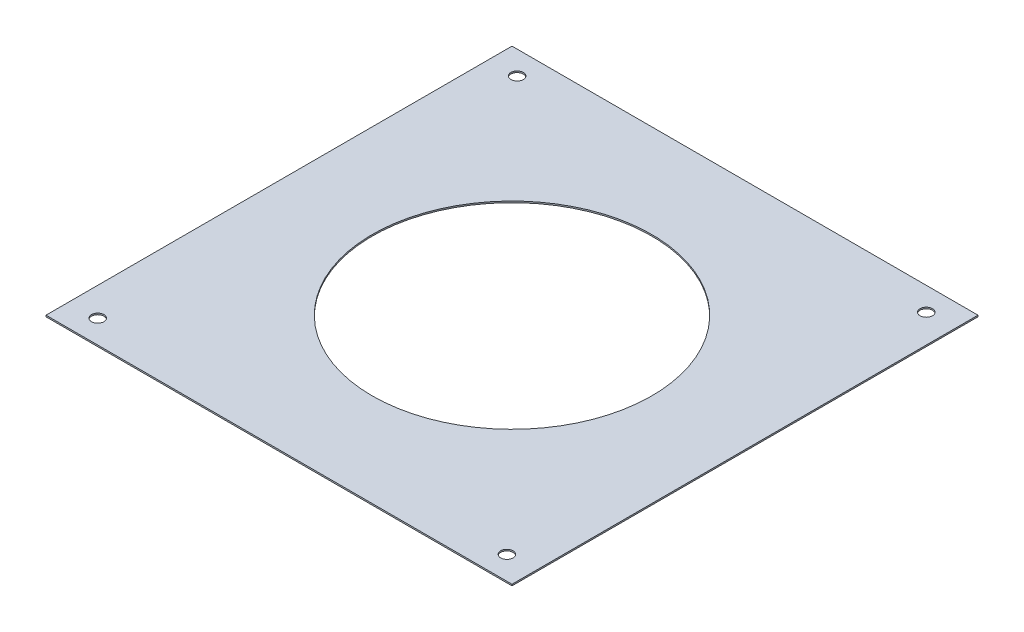
ISO-10303-21;
HEADER;
FILE_DESCRIPTION(('STEP AP214'),'2;1');
FILE_NAME('part.step','',(''),(''),'','','');
FILE_SCHEMA(('AUTOMOTIVE_DESIGN { 1 0 10303 214 1 1 1 1 }'));
ENDSEC;
DATA;
#1=APPLICATION_CONTEXT('core data for automotive mechanical design processes');
#2=APPLICATION_PROTOCOL_DEFINITION('international standard','automotive_design',2000,#1);
#3=PRODUCT_CONTEXT('',#1,'mechanical');
#4=PRODUCT('Part','Part','',(#3));
#5=PRODUCT_RELATED_PRODUCT_CATEGORY('part','',(#4));
#6=PRODUCT_DEFINITION_FORMATION('','',#4);
#7=PRODUCT_DEFINITION_CONTEXT('part definition',#1,'design');
#8=PRODUCT_DEFINITION('design','',#6,#7);
#9=PRODUCT_DEFINITION_SHAPE('','',#8);
#10=(LENGTH_UNIT() NAMED_UNIT(*) SI_UNIT(.MILLI.,.METRE.));
#11=(NAMED_UNIT(*) PLANE_ANGLE_UNIT() SI_UNIT($,.RADIAN.));
#12=(NAMED_UNIT(*) SI_UNIT($,.STERADIAN.) SOLID_ANGLE_UNIT());
#13=UNCERTAINTY_MEASURE_WITH_UNIT(LENGTH_MEASURE(1.E-05),#10,'distance_accuracy_value','');
#14=(GEOMETRIC_REPRESENTATION_CONTEXT(3) GLOBAL_UNCERTAINTY_ASSIGNED_CONTEXT((#13)) GLOBAL_UNIT_ASSIGNED_CONTEXT((#10,
#11,#12)) REPRESENTATION_CONTEXT('',''));
#15=CARTESIAN_POINT('',(0.,0.,0.));
#16=DIRECTION('',(0.,0.,1.));
#17=DIRECTION('',(1.,0.,0.));
#18=AXIS2_PLACEMENT_3D('',#15,#16,#17);
#19=CARTESIAN_POINT('',(0.,0.79375,0.));
#20=DIRECTION('',(0.,-1.,0.));
#21=DIRECTION('',(0.,0.,-1.));
#22=AXIS2_PLACEMENT_3D('',#19,#20,#21);
#23=PLANE('',#22);
#24=CARTESIAN_POINT('',(0.,0.79375,0.));
#25=DIRECTION('',(0.,1.,0.));
#26=DIRECTION('',(0.,0.,1.));
#27=AXIS2_PLACEMENT_3D('',#24,#25,#26);
#28=CIRCLE('',#27,76.2);
#29=CARTESIAN_POINT('',(0.,0.79375,76.2));
#30=VERTEX_POINT('',#29);
#31=EDGE_CURVE('E138',#30,#30,#28,.T.);
#32=ORIENTED_EDGE('',*,*,#31,.F.);
#33=EDGE_LOOP('',(#32));
#34=FACE_BOUND('',#33,.T.);
#35=CARTESIAN_POINT('',(111.506,0.79375,114.3));
#36=DIRECTION('',(0.,1.,0.));
#37=DIRECTION('',(0.,0.,1.));
#38=AXIS2_PLACEMENT_3D('',#35,#36,#37);
#39=CIRCLE('',#38,3.37819999999999);
#40=CARTESIAN_POINT('',(111.506,0.79375,117.6782));
#41=VERTEX_POINT('',#40);
#42=EDGE_CURVE('E123',#41,#41,#39,.T.);
#43=ORIENTED_EDGE('',*,*,#42,.F.);
#44=EDGE_LOOP('',(#43));
#45=FACE_BOUND('',#44,.T.);
#46=CARTESIAN_POINT('',(-111.506,0.79375,-114.3));
#47=DIRECTION('',(0.,1.,0.));
#48=DIRECTION('',(0.,0.,1.));
#49=AXIS2_PLACEMENT_3D('',#46,#47,#48);
#50=CIRCLE('',#49,3.37819999999999);
#51=CARTESIAN_POINT('',(-111.506,0.79375,-110.9218));
#52=VERTEX_POINT('',#51);
#53=EDGE_CURVE('E102',#52,#52,#50,.T.);
#54=ORIENTED_EDGE('',*,*,#53,.F.);
#55=EDGE_LOOP('',(#54));
#56=FACE_BOUND('',#55,.T.);
#57=DIRECTION('',(0.,0.,-1.));
#58=VECTOR('',#57,1.);
#59=CARTESIAN_POINT('',(127.,0.79375,127.));
#60=LINE('',#59,#58);
#61=CARTESIAN_POINT('',(127.,0.79375,127.));
#62=VERTEX_POINT('',#61);
#63=CARTESIAN_POINT('',(127.,0.79375,-127.));
#64=VERTEX_POINT('',#63);
#65=EDGE_CURVE('E87',#62,#64,#60,.T.);
#66=ORIENTED_EDGE('',*,*,#65,.T.);
#67=DIRECTION('',(-1.,0.,0.));
#68=VECTOR('',#67,1.);
#69=CARTESIAN_POINT('',(-127.,0.79375,-127.));
#70=LINE('',#69,#68);
#71=CARTESIAN_POINT('',(-127.,0.79375,-127.));
#72=VERTEX_POINT('',#71);
#73=EDGE_CURVE('E82',#64,#72,#70,.T.);
#74=ORIENTED_EDGE('',*,*,#73,.T.);
#75=DIRECTION('',(0.,0.,1.));
#76=VECTOR('',#75,1.);
#77=CARTESIAN_POINT('',(-127.,0.79375,127.));
#78=LINE('',#77,#76);
#79=CARTESIAN_POINT('',(-127.,0.79375,127.));
#80=VERTEX_POINT('',#79);
#81=EDGE_CURVE('E85',#72,#80,#78,.T.);
#82=ORIENTED_EDGE('',*,*,#81,.T.);
#83=DIRECTION('',(1.,0.,0.));
#84=VECTOR('',#83,1.);
#85=CARTESIAN_POINT('',(-127.,0.79375,127.));
#86=LINE('',#85,#84);
#87=EDGE_CURVE('E52',#80,#62,#86,.T.);
#88=ORIENTED_EDGE('',*,*,#87,.T.);
#89=EDGE_LOOP('',(#66,#74,#82,#88));
#90=FACE_BOUND('',#89,.T.);
#91=CARTESIAN_POINT('',(111.506,0.79375,-114.3));
#92=DIRECTION('',(0.,1.,0.));
#93=DIRECTION('',(0.,0.,1.));
#94=AXIS2_PLACEMENT_3D('',#91,#92,#93);
#95=CIRCLE('',#94,3.37819999999999);
#96=CARTESIAN_POINT('',(111.506,0.79375,-110.9218));
#97=VERTEX_POINT('',#96);
#98=EDGE_CURVE('E117',#97,#97,#95,.T.);
#99=ORIENTED_EDGE('',*,*,#98,.F.);
#100=EDGE_LOOP('',(#99));
#101=FACE_BOUND('',#100,.T.);
#102=CARTESIAN_POINT('',(-111.506,0.79375,114.3));
#103=DIRECTION('',(0.,1.,0.));
#104=DIRECTION('',(0.,0.,1.));
#105=AXIS2_PLACEMENT_3D('',#102,#103,#104);
#106=CIRCLE('',#105,3.37819999999999);
#107=CARTESIAN_POINT('',(-111.506,0.79375,117.6782));
#108=VERTEX_POINT('',#107);
#109=EDGE_CURVE('E129',#108,#108,#106,.T.);
#110=ORIENTED_EDGE('',*,*,#109,.F.);
#111=EDGE_LOOP('',(#110));
#112=FACE_BOUND('',#111,.T.);
#113=ADVANCED_FACE('F35',(#34,#45,#56,#90,#101,#112),#23,.F.);
#114=CARTESIAN_POINT('',(0.,0.,0.));
#115=DIRECTION('',(0.,-1.,0.));
#116=DIRECTION('',(0.,0.,-1.));
#117=AXIS2_PLACEMENT_3D('',#114,#115,#116);
#118=PLANE('',#117);
#119=CARTESIAN_POINT('',(0.,0.,0.));
#120=DIRECTION('',(0.,1.,0.));
#121=DIRECTION('',(0.,0.,1.));
#122=AXIS2_PLACEMENT_3D('',#119,#120,#121);
#123=CIRCLE('',#122,76.2);
#124=CARTESIAN_POINT('',(0.,0.,76.2));
#125=VERTEX_POINT('',#124);
#126=EDGE_CURVE('E135',#125,#125,#123,.T.);
#127=ORIENTED_EDGE('',*,*,#126,.T.);
#128=EDGE_LOOP('',(#127));
#129=FACE_BOUND('',#128,.T.);
#130=CARTESIAN_POINT('',(111.506,0.,114.3));
#131=DIRECTION('',(0.,1.,0.));
#132=DIRECTION('',(0.,0.,1.));
#133=AXIS2_PLACEMENT_3D('',#130,#131,#132);
#134=CIRCLE('',#133,3.37819999999999);
#135=CARTESIAN_POINT('',(111.506,0.,117.6782));
#136=VERTEX_POINT('',#135);
#137=EDGE_CURVE('E126',#136,#136,#134,.T.);
#138=ORIENTED_EDGE('',*,*,#137,.T.);
#139=EDGE_LOOP('',(#138));
#140=FACE_BOUND('',#139,.T.);
#141=CARTESIAN_POINT('',(-111.506,0.,-114.3));
#142=DIRECTION('',(0.,1.,0.));
#143=DIRECTION('',(0.,0.,1.));
#144=AXIS2_PLACEMENT_3D('',#141,#142,#143);
#145=CIRCLE('',#144,3.37819999999999);
#146=CARTESIAN_POINT('',(-111.506,0.,-110.9218));
#147=VERTEX_POINT('',#146);
#148=EDGE_CURVE('E114',#147,#147,#145,.T.);
#149=ORIENTED_EDGE('',*,*,#148,.T.);
#150=EDGE_LOOP('',(#149));
#151=FACE_BOUND('',#150,.T.);
#152=DIRECTION('',(0.,0.,-1.));
#153=VECTOR('',#152,1.);
#154=CARTESIAN_POINT('',(127.,0.,127.));
#155=LINE('',#154,#153);
#156=CARTESIAN_POINT('',(127.,0.,127.));
#157=VERTEX_POINT('',#156);
#158=CARTESIAN_POINT('',(127.,0.,-127.));
#159=VERTEX_POINT('',#158);
#160=EDGE_CURVE('E99',#157,#159,#155,.T.);
#161=ORIENTED_EDGE('',*,*,#160,.F.);
#162=DIRECTION('',(1.,0.,0.));
#163=VECTOR('',#162,1.);
#164=CARTESIAN_POINT('',(-127.,0.,127.));
#165=LINE('',#164,#163);
#166=CARTESIAN_POINT('',(-127.,0.,127.));
#167=VERTEX_POINT('',#166);
#168=EDGE_CURVE('E75',#167,#157,#165,.T.);
#169=ORIENTED_EDGE('',*,*,#168,.F.);
#170=DIRECTION('',(0.,0.,1.));
#171=VECTOR('',#170,1.);
#172=CARTESIAN_POINT('',(-127.,0.,127.));
#173=LINE('',#172,#171);
#174=CARTESIAN_POINT('',(-127.,0.,-127.));
#175=VERTEX_POINT('',#174);
#176=EDGE_CURVE('E69',#175,#167,#173,.T.);
#177=ORIENTED_EDGE('',*,*,#176,.F.);
#178=DIRECTION('',(-1.,0.,0.));
#179=VECTOR('',#178,1.);
#180=CARTESIAN_POINT('',(-127.,0.,-127.));
#181=LINE('',#180,#179);
#182=EDGE_CURVE('E91',#159,#175,#181,.T.);
#183=ORIENTED_EDGE('',*,*,#182,.F.);
#184=EDGE_LOOP('',(#161,#169,#177,#183));
#185=FACE_BOUND('',#184,.T.);
#186=CARTESIAN_POINT('',(111.506,0.,-114.3));
#187=DIRECTION('',(0.,1.,0.));
#188=DIRECTION('',(0.,0.,1.));
#189=AXIS2_PLACEMENT_3D('',#186,#187,#188);
#190=CIRCLE('',#189,3.37819999999999);
#191=CARTESIAN_POINT('',(111.506,0.,-110.9218));
#192=VERTEX_POINT('',#191);
#193=EDGE_CURVE('E120',#192,#192,#190,.T.);
#194=ORIENTED_EDGE('',*,*,#193,.T.);
#195=EDGE_LOOP('',(#194));
#196=FACE_BOUND('',#195,.T.);
#197=CARTESIAN_POINT('',(-111.506,0.,114.3));
#198=DIRECTION('',(0.,1.,0.));
#199=DIRECTION('',(0.,0.,1.));
#200=AXIS2_PLACEMENT_3D('',#197,#198,#199);
#201=CIRCLE('',#200,3.37819999999999);
#202=CARTESIAN_POINT('',(-111.506,0.,117.6782));
#203=VERTEX_POINT('',#202);
#204=EDGE_CURVE('E132',#203,#203,#201,.T.);
#205=ORIENTED_EDGE('',*,*,#204,.T.);
#206=EDGE_LOOP('',(#205));
#207=FACE_BOUND('',#206,.T.);
#208=ADVANCED_FACE('F110',(#129,#140,#151,#185,#196,#207),#118,.T.);
#209=CARTESIAN_POINT('',(127.,0.79375,127.));
#210=DIRECTION('',(-1.,0.,0.));
#211=DIRECTION('',(0.,0.,1.));
#212=AXIS2_PLACEMENT_3D('',#209,#210,#211);
#213=PLANE('',#212);
#214=ORIENTED_EDGE('',*,*,#160,.T.);
#215=DIRECTION('',(0.,-1.,0.));
#216=VECTOR('',#215,1.);
#217=CARTESIAN_POINT('',(127.,0.79375,-127.));
#218=LINE('',#217,#216);
#219=EDGE_CURVE('E11',#64,#159,#218,.T.);
#220=ORIENTED_EDGE('',*,*,#219,.F.);
#221=ORIENTED_EDGE('',*,*,#65,.F.);
#222=DIRECTION('',(0.,-1.,0.));
#223=VECTOR('',#222,1.);
#224=CARTESIAN_POINT('',(127.,0.79375,127.));
#225=LINE('',#224,#223);
#226=EDGE_CURVE('E95',#62,#157,#225,.T.);
#227=ORIENTED_EDGE('',*,*,#226,.T.);
#228=EDGE_LOOP('',(#214,#220,#221,#227));
#229=FACE_BOUND('',#228,.T.);
#230=ADVANCED_FACE('F37',(#229),#213,.F.);
#231=CARTESIAN_POINT('',(-127.,0.79375,-127.));
#232=DIRECTION('',(0.,0.,1.));
#233=DIRECTION('',(1.,0.,0.));
#234=AXIS2_PLACEMENT_3D('',#231,#232,#233);
#235=PLANE('',#234);
#236=ORIENTED_EDGE('',*,*,#182,.T.);
#237=DIRECTION('',(0.,-1.,0.));
#238=VECTOR('',#237,1.);
#239=CARTESIAN_POINT('',(-127.,0.79375,-127.));
#240=LINE('',#239,#238);
#241=EDGE_CURVE('E44',#72,#175,#240,.T.);
#242=ORIENTED_EDGE('',*,*,#241,.F.);
#243=ORIENTED_EDGE('',*,*,#73,.F.);
#244=ORIENTED_EDGE('',*,*,#219,.T.);
#245=EDGE_LOOP('',(#236,#242,#243,#244));
#246=FACE_BOUND('',#245,.T.);
#247=ADVANCED_FACE('F90',(#246),#235,.F.);
#248=CARTESIAN_POINT('',(-127.,0.79375,127.));
#249=DIRECTION('',(1.,0.,0.));
#250=DIRECTION('',(0.,0.,-1.));
#251=AXIS2_PLACEMENT_3D('',#248,#249,#250);
#252=PLANE('',#251);
#253=ORIENTED_EDGE('',*,*,#176,.T.);
#254=DIRECTION('',(0.,-1.,0.));
#255=VECTOR('',#254,1.);
#256=CARTESIAN_POINT('',(-127.,0.79375,127.));
#257=LINE('',#256,#255);
#258=EDGE_CURVE('E92',#80,#167,#257,.T.);
#259=ORIENTED_EDGE('',*,*,#258,.F.);
#260=ORIENTED_EDGE('',*,*,#81,.F.);
#261=ORIENTED_EDGE('',*,*,#241,.T.);
#262=EDGE_LOOP('',(#253,#259,#260,#261));
#263=FACE_BOUND('',#262,.T.);
#264=ADVANCED_FACE('F93',(#263),#252,.F.);
#265=CARTESIAN_POINT('',(-127.,0.79375,127.));
#266=DIRECTION('',(0.,0.,-1.));
#267=DIRECTION('',(-1.,0.,0.));
#268=AXIS2_PLACEMENT_3D('',#265,#266,#267);
#269=PLANE('',#268);
#270=ORIENTED_EDGE('',*,*,#168,.T.);
#271=ORIENTED_EDGE('',*,*,#226,.F.);
#272=ORIENTED_EDGE('',*,*,#87,.F.);
#273=ORIENTED_EDGE('',*,*,#258,.T.);
#274=EDGE_LOOP('',(#270,#271,#272,#273));
#275=FACE_BOUND('',#274,.T.);
#276=ADVANCED_FACE('F107',(#275),#269,.F.);
#277=CARTESIAN_POINT('',(-111.506,0.79375,-114.3));
#278=DIRECTION('',(0.,-1.,0.));
#279=DIRECTION('',(0.,0.,-1.));
#280=AXIS2_PLACEMENT_3D('',#277,#278,#279);
#281=CYLINDRICAL_SURFACE('',#280,3.37819999999999);
#282=ORIENTED_EDGE('',*,*,#53,.T.);
#283=EDGE_LOOP('',(#282));
#284=FACE_BOUND('',#283,.T.);
#285=ORIENTED_EDGE('',*,*,#148,.F.);
#286=EDGE_LOOP('',(#285));
#287=FACE_BOUND('',#286,.T.);
#288=ADVANCED_FACE('F160',(#284,#287),#281,.F.);
#289=CARTESIAN_POINT('',(111.506,0.79375,-114.3));
#290=DIRECTION('',(0.,-1.,0.));
#291=DIRECTION('',(0.,0.,-1.));
#292=AXIS2_PLACEMENT_3D('',#289,#290,#291);
#293=CYLINDRICAL_SURFACE('',#292,3.37819999999999);
#294=ORIENTED_EDGE('',*,*,#98,.T.);
#295=EDGE_LOOP('',(#294));
#296=FACE_BOUND('',#295,.T.);
#297=ORIENTED_EDGE('',*,*,#193,.F.);
#298=EDGE_LOOP('',(#297));
#299=FACE_BOUND('',#298,.T.);
#300=ADVANCED_FACE('F163',(#296,#299),#293,.F.);
#301=CARTESIAN_POINT('',(111.506,0.79375,114.3));
#302=DIRECTION('',(0.,-1.,0.));
#303=DIRECTION('',(0.,0.,-1.));
#304=AXIS2_PLACEMENT_3D('',#301,#302,#303);
#305=CYLINDRICAL_SURFACE('',#304,3.37819999999999);
#306=ORIENTED_EDGE('',*,*,#42,.T.);
#307=EDGE_LOOP('',(#306));
#308=FACE_BOUND('',#307,.T.);
#309=ORIENTED_EDGE('',*,*,#137,.F.);
#310=EDGE_LOOP('',(#309));
#311=FACE_BOUND('',#310,.T.);
#312=ADVANCED_FACE('F199',(#308,#311),#305,.F.);
#313=CARTESIAN_POINT('',(-111.506,0.79375,114.3));
#314=DIRECTION('',(0.,-1.,0.));
#315=DIRECTION('',(0.,0.,-1.));
#316=AXIS2_PLACEMENT_3D('',#313,#314,#315);
#317=CYLINDRICAL_SURFACE('',#316,3.37819999999999);
#318=ORIENTED_EDGE('',*,*,#109,.T.);
#319=EDGE_LOOP('',(#318));
#320=FACE_BOUND('',#319,.T.);
#321=ORIENTED_EDGE('',*,*,#204,.F.);
#322=EDGE_LOOP('',(#321));
#323=FACE_BOUND('',#322,.T.);
#324=ADVANCED_FACE('F149',(#320,#323),#317,.F.);
#325=CARTESIAN_POINT('',(0.,0.,0.));
#326=DIRECTION('',(0.,1.,0.));
#327=DIRECTION('',(0.,0.,1.));
#328=AXIS2_PLACEMENT_3D('',#325,#326,#327);
#329=CYLINDRICAL_SURFACE('',#328,76.2);
#330=ORIENTED_EDGE('',*,*,#126,.F.);
#331=EDGE_LOOP('',(#330));
#332=FACE_BOUND('',#331,.T.);
#333=ORIENTED_EDGE('',*,*,#31,.T.);
#334=EDGE_LOOP('',(#333));
#335=FACE_BOUND('',#334,.T.);
#336=ADVANCED_FACE('F146',(#332,#335),#329,.F.);
#337=CLOSED_SHELL('',(#113,#208,#230,#247,#264,#276,#288,#300,#312,#324,#336));
#338=MANIFOLD_SOLID_BREP('B2',#337);
#339=ADVANCED_BREP_SHAPE_REPRESENTATION('',(#18,#338),#14);
#340=SHAPE_DEFINITION_REPRESENTATION(#9,#339);
ENDSEC;
END-ISO-10303-21;
